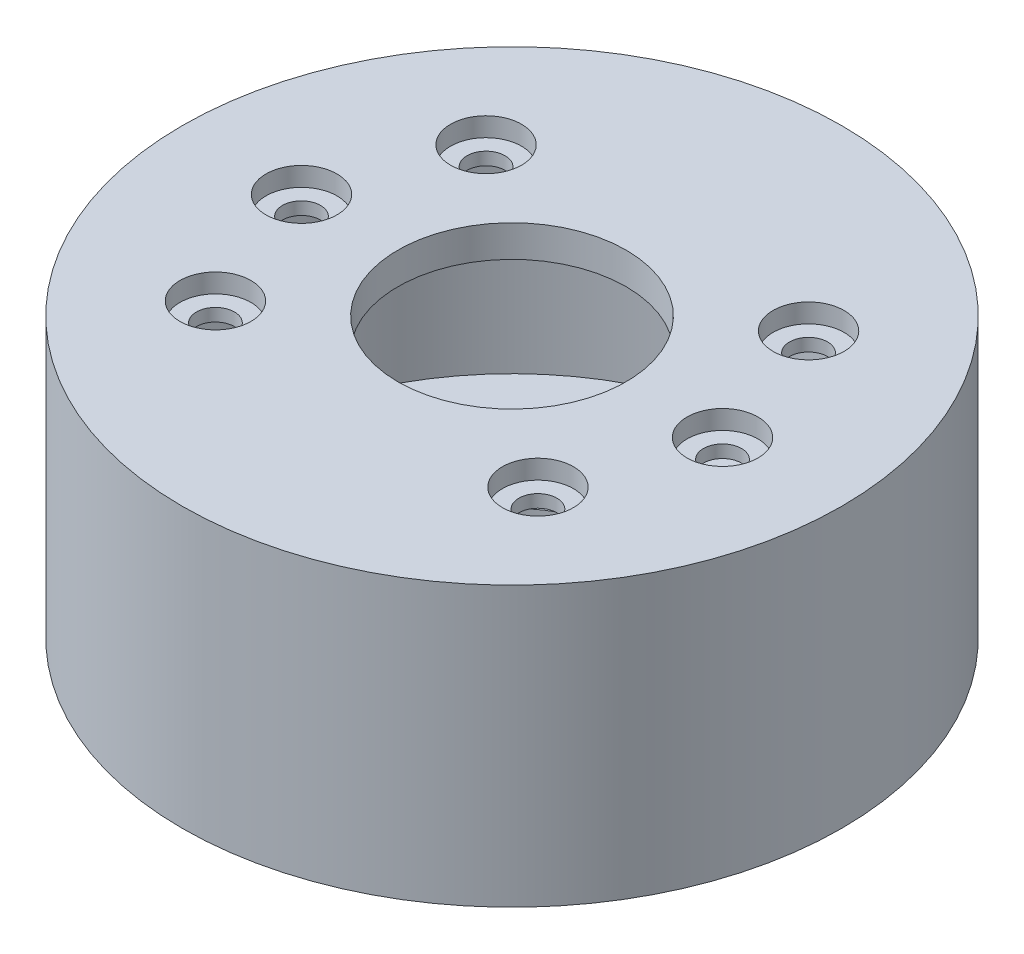
ISO-10303-21;
HEADER;
FILE_DESCRIPTION(('STEP AP214'),'2;1');
FILE_NAME('part.step','',(''),(''),'','','');
FILE_SCHEMA(('AUTOMOTIVE_DESIGN { 1 0 10303 214 1 1 1 1 }'));
ENDSEC;
DATA;
#1=APPLICATION_CONTEXT('core data for automotive mechanical design processes');
#2=APPLICATION_PROTOCOL_DEFINITION('international standard','automotive_design',2000,#1);
#3=PRODUCT_CONTEXT('',#1,'mechanical');
#4=PRODUCT('Part','Part','',(#3));
#5=PRODUCT_RELATED_PRODUCT_CATEGORY('part','',(#4));
#6=PRODUCT_DEFINITION_FORMATION('','',#4);
#7=PRODUCT_DEFINITION_CONTEXT('part definition',#1,'design');
#8=PRODUCT_DEFINITION('design','',#6,#7);
#9=PRODUCT_DEFINITION_SHAPE('','',#8);
#10=(LENGTH_UNIT() NAMED_UNIT(*) SI_UNIT(.MILLI.,.METRE.));
#11=(NAMED_UNIT(*) PLANE_ANGLE_UNIT() SI_UNIT($,.RADIAN.));
#12=(NAMED_UNIT(*) SI_UNIT($,.STERADIAN.) SOLID_ANGLE_UNIT());
#13=UNCERTAINTY_MEASURE_WITH_UNIT(LENGTH_MEASURE(1.E-05),#10,'distance_accuracy_value','');
#14=(GEOMETRIC_REPRESENTATION_CONTEXT(3) GLOBAL_UNCERTAINTY_ASSIGNED_CONTEXT((#13)) GLOBAL_UNIT_ASSIGNED_CONTEXT((#10,
#11,#12)) REPRESENTATION_CONTEXT('',''));
#15=CARTESIAN_POINT('',(0.,0.,0.));
#16=DIRECTION('',(0.,0.,1.));
#17=DIRECTION('',(1.,0.,0.));
#18=AXIS2_PLACEMENT_3D('',#15,#16,#17);
#19=CARTESIAN_POINT('',(-12.7163377557751,19.5,-10.6702743207965));
#20=DIRECTION('',(0.,1.,0.));
#21=DIRECTION('',(0.,0.,1.));
#22=AXIS2_PLACEMENT_3D('',#19,#20,#21);
#23=CYLINDRICAL_SURFACE('',#22,1.5);
#24=CARTESIAN_POINT('',(-12.7163377557751,19.5,-10.6702743207965));
#25=DIRECTION('',(0.,1.,0.));
#26=DIRECTION('',(0.,0.,1.));
#27=AXIS2_PLACEMENT_3D('',#24,#25,#26);
#28=CIRCLE('',#27,1.5);
#29=CARTESIAN_POINT('',(-12.7163377557751,19.5,-9.17027432079648));
#30=VERTEX_POINT('',#29);
#31=EDGE_CURVE('E189',#30,#30,#28,.T.);
#32=ORIENTED_EDGE('',*,*,#31,.F.);
#33=EDGE_LOOP('',(#32));
#34=FACE_BOUND('',#33,.T.);
#35=CARTESIAN_POINT('',(-12.7163377557751,20.5,-10.6702743207965));
#36=DIRECTION('',(0.,1.,0.));
#37=DIRECTION('',(0.,0.,1.));
#38=AXIS2_PLACEMENT_3D('',#35,#36,#37);
#39=CIRCLE('',#38,1.5);
#40=CARTESIAN_POINT('',(-12.7163377557751,20.5,-9.17027432079648));
#41=VERTEX_POINT('',#40);
#42=EDGE_CURVE('E79',#41,#41,#39,.F.);
#43=ORIENTED_EDGE('',*,*,#42,.F.);
#44=EDGE_LOOP('',(#43));
#45=FACE_BOUND('',#44,.T.);
#46=ADVANCED_FACE('F75',(#34,#45),#23,.F.);
#47=CARTESIAN_POINT('',(16.6,19.5,0.));
#48=DIRECTION('',(0.,1.,0.));
#49=DIRECTION('',(0.,0.,1.));
#50=AXIS2_PLACEMENT_3D('',#47,#48,#49);
#51=CYLINDRICAL_SURFACE('',#50,1.5);
#52=CARTESIAN_POINT('',(16.6,19.5,0.));
#53=DIRECTION('',(0.,1.,0.));
#54=DIRECTION('',(0.,0.,1.));
#55=AXIS2_PLACEMENT_3D('',#52,#53,#54);
#56=CIRCLE('',#55,1.5);
#57=CARTESIAN_POINT('',(16.6,19.5,1.5));
#58=VERTEX_POINT('',#57);
#59=EDGE_CURVE('E186',#58,#58,#56,.T.);
#60=ORIENTED_EDGE('',*,*,#59,.F.);
#61=EDGE_LOOP('',(#60));
#62=FACE_BOUND('',#61,.T.);
#63=CARTESIAN_POINT('',(16.6,20.5,0.));
#64=DIRECTION('',(0.,1.,0.));
#65=DIRECTION('',(0.,0.,1.));
#66=AXIS2_PLACEMENT_3D('',#63,#64,#65);
#67=CIRCLE('',#66,1.5);
#68=CARTESIAN_POINT('',(16.6,20.5,1.5));
#69=VERTEX_POINT('',#68);
#70=EDGE_CURVE('E129',#69,#69,#67,.F.);
#71=ORIENTED_EDGE('',*,*,#70,.F.);
#72=EDGE_LOOP('',(#71));
#73=FACE_BOUND('',#72,.T.);
#74=ADVANCED_FACE('F239',(#62,#73),#51,.F.);
#75=CARTESIAN_POINT('',(12.7163377557751,19.5,-10.6702743207965));
#76=DIRECTION('',(0.,1.,0.));
#77=DIRECTION('',(0.,0.,1.));
#78=AXIS2_PLACEMENT_3D('',#75,#76,#77);
#79=CYLINDRICAL_SURFACE('',#78,1.5);
#80=CARTESIAN_POINT('',(12.7163377557751,19.5,-10.6702743207965));
#81=DIRECTION('',(0.,1.,0.));
#82=DIRECTION('',(0.,0.,1.));
#83=AXIS2_PLACEMENT_3D('',#80,#81,#82);
#84=CIRCLE('',#83,1.5);
#85=CARTESIAN_POINT('',(12.7163377557751,19.5,-9.17027432079648));
#86=VERTEX_POINT('',#85);
#87=EDGE_CURVE('E183',#86,#86,#84,.T.);
#88=ORIENTED_EDGE('',*,*,#87,.F.);
#89=EDGE_LOOP('',(#88));
#90=FACE_BOUND('',#89,.T.);
#91=CARTESIAN_POINT('',(12.7163377557751,20.5,-10.6702743207965));
#92=DIRECTION('',(0.,1.,0.));
#93=DIRECTION('',(0.,0.,1.));
#94=AXIS2_PLACEMENT_3D('',#91,#92,#93);
#95=CIRCLE('',#94,1.5);
#96=CARTESIAN_POINT('',(12.7163377557751,20.5,-9.17027432079648));
#97=VERTEX_POINT('',#96);
#98=EDGE_CURVE('E127',#97,#97,#95,.F.);
#99=ORIENTED_EDGE('',*,*,#98,.F.);
#100=EDGE_LOOP('',(#99));
#101=FACE_BOUND('',#100,.T.);
#102=ADVANCED_FACE('F245',(#90,#101),#79,.F.);
#103=CARTESIAN_POINT('',(12.7163377557751,19.5,10.6702743207965));
#104=DIRECTION('',(0.,1.,0.));
#105=DIRECTION('',(0.,0.,1.));
#106=AXIS2_PLACEMENT_3D('',#103,#104,#105);
#107=CYLINDRICAL_SURFACE('',#106,1.5);
#108=CARTESIAN_POINT('',(12.7163377557751,19.5,10.6702743207965));
#109=DIRECTION('',(0.,1.,0.));
#110=DIRECTION('',(0.,0.,1.));
#111=AXIS2_PLACEMENT_3D('',#108,#109,#110);
#112=CIRCLE('',#111,1.5);
#113=CARTESIAN_POINT('',(12.7163377557751,19.5,12.1702743207965));
#114=VERTEX_POINT('',#113);
#115=EDGE_CURVE('E180',#114,#114,#112,.T.);
#116=ORIENTED_EDGE('',*,*,#115,.F.);
#117=EDGE_LOOP('',(#116));
#118=FACE_BOUND('',#117,.T.);
#119=CARTESIAN_POINT('',(12.7163377557751,20.5,10.6702743207965));
#120=DIRECTION('',(0.,1.,0.));
#121=DIRECTION('',(0.,0.,1.));
#122=AXIS2_PLACEMENT_3D('',#119,#120,#121);
#123=CIRCLE('',#122,1.5);
#124=CARTESIAN_POINT('',(12.7163377557751,20.5,12.1702743207965));
#125=VERTEX_POINT('',#124);
#126=EDGE_CURVE('E124',#125,#125,#123,.F.);
#127=ORIENTED_EDGE('',*,*,#126,.F.);
#128=EDGE_LOOP('',(#127));
#129=FACE_BOUND('',#128,.T.);
#130=ADVANCED_FACE('F366',(#118,#129),#107,.F.);
#131=CARTESIAN_POINT('',(-12.7163377557751,19.5,10.6702743207965));
#132=DIRECTION('',(0.,1.,0.));
#133=DIRECTION('',(0.,0.,1.));
#134=AXIS2_PLACEMENT_3D('',#131,#132,#133);
#135=CYLINDRICAL_SURFACE('',#134,1.5);
#136=CARTESIAN_POINT('',(-12.7163377557751,19.5,10.6702743207965));
#137=DIRECTION('',(0.,1.,0.));
#138=DIRECTION('',(0.,0.,1.));
#139=AXIS2_PLACEMENT_3D('',#136,#137,#138);
#140=CIRCLE('',#139,1.5);
#141=CARTESIAN_POINT('',(-12.7163377557751,19.5,12.1702743207965));
#142=VERTEX_POINT('',#141);
#143=EDGE_CURVE('E177',#142,#142,#140,.T.);
#144=ORIENTED_EDGE('',*,*,#143,.F.);
#145=EDGE_LOOP('',(#144));
#146=FACE_BOUND('',#145,.T.);
#147=CARTESIAN_POINT('',(-12.7163377557751,20.5,10.6702743207965));
#148=DIRECTION('',(0.,1.,0.));
#149=DIRECTION('',(0.,0.,1.));
#150=AXIS2_PLACEMENT_3D('',#147,#148,#149);
#151=CIRCLE('',#150,1.5);
#152=CARTESIAN_POINT('',(-12.7163377557751,20.5,12.1702743207965));
#153=VERTEX_POINT('',#152);
#154=EDGE_CURVE('E120',#153,#153,#151,.F.);
#155=ORIENTED_EDGE('',*,*,#154,.F.);
#156=EDGE_LOOP('',(#155));
#157=FACE_BOUND('',#156,.T.);
#158=ADVANCED_FACE('F307',(#146,#157),#135,.F.);
#159=CARTESIAN_POINT('',(-16.6,19.5,0.));
#160=DIRECTION('',(0.,1.,0.));
#161=DIRECTION('',(0.,0.,1.));
#162=AXIS2_PLACEMENT_3D('',#159,#160,#161);
#163=CYLINDRICAL_SURFACE('',#162,1.5);
#164=CARTESIAN_POINT('',(-16.6,19.5,0.));
#165=DIRECTION('',(0.,1.,0.));
#166=DIRECTION('',(0.,0.,1.));
#167=AXIS2_PLACEMENT_3D('',#164,#165,#166);
#168=CIRCLE('',#167,1.5);
#169=CARTESIAN_POINT('',(-16.6,19.5,1.5));
#170=VERTEX_POINT('',#169);
#171=EDGE_CURVE('E116',#170,#170,#168,.T.);
#172=ORIENTED_EDGE('',*,*,#171,.F.);
#173=EDGE_LOOP('',(#172));
#174=FACE_BOUND('',#173,.T.);
#175=CARTESIAN_POINT('',(-16.6,20.5,0.));
#176=DIRECTION('',(0.,1.,0.));
#177=DIRECTION('',(0.,0.,1.));
#178=AXIS2_PLACEMENT_3D('',#175,#176,#177);
#179=CIRCLE('',#178,1.5);
#180=CARTESIAN_POINT('',(-16.6,20.5,1.5));
#181=VERTEX_POINT('',#180);
#182=EDGE_CURVE('E117',#181,#181,#179,.F.);
#183=ORIENTED_EDGE('',*,*,#182,.F.);
#184=EDGE_LOOP('',(#183));
#185=FACE_BOUND('',#184,.T.);
#186=ADVANCED_FACE('F302',(#174,#185),#163,.F.);
#187=CARTESIAN_POINT('',(-12.7163377557751,2.5,-10.6702743207965));
#188=DIRECTION('',(0.,-1.,0.));
#189=DIRECTION('',(0.,0.,-1.));
#190=AXIS2_PLACEMENT_3D('',#187,#188,#189);
#191=CYLINDRICAL_SURFACE('',#190,1.5);
#192=CARTESIAN_POINT('',(-12.7163377557751,2.5,-10.6702743207965));
#193=DIRECTION('',(0.,1.,0.));
#194=DIRECTION('',(0.,0.,1.));
#195=AXIS2_PLACEMENT_3D('',#192,#193,#194);
#196=CIRCLE('',#195,1.5);
#197=CARTESIAN_POINT('',(-12.7163377557751,2.5,-9.17027432079648));
#198=VERTEX_POINT('',#197);
#199=EDGE_CURVE('E216',#198,#198,#196,.F.);
#200=ORIENTED_EDGE('',*,*,#199,.F.);
#201=EDGE_LOOP('',(#200));
#202=FACE_BOUND('',#201,.T.);
#203=CARTESIAN_POINT('',(-12.7163377557751,1.5,-10.6702743207965));
#204=DIRECTION('',(0.,-1.,0.));
#205=DIRECTION('',(0.,0.,-1.));
#206=AXIS2_PLACEMENT_3D('',#203,#204,#205);
#207=CIRCLE('',#206,1.5);
#208=CARTESIAN_POINT('',(-12.7163377557751,1.5,-12.1702743207965));
#209=VERTEX_POINT('',#208);
#210=EDGE_CURVE('E113',#209,#209,#207,.F.);
#211=ORIENTED_EDGE('',*,*,#210,.F.);
#212=EDGE_LOOP('',(#211));
#213=FACE_BOUND('',#212,.T.);
#214=ADVANCED_FACE('F299',(#202,#213),#191,.F.);
#215=CARTESIAN_POINT('',(16.6,2.5,0.));
#216=DIRECTION('',(0.,-1.,0.));
#217=DIRECTION('',(0.,0.,-1.));
#218=AXIS2_PLACEMENT_3D('',#215,#216,#217);
#219=CYLINDRICAL_SURFACE('',#218,1.5);
#220=CARTESIAN_POINT('',(16.6,2.5,0.));
#221=DIRECTION('',(0.,1.,0.));
#222=DIRECTION('',(0.,0.,1.));
#223=AXIS2_PLACEMENT_3D('',#220,#221,#222);
#224=CIRCLE('',#223,1.5);
#225=CARTESIAN_POINT('',(16.6,2.5,1.5));
#226=VERTEX_POINT('',#225);
#227=EDGE_CURVE('E213',#226,#226,#224,.T.);
#228=ORIENTED_EDGE('',*,*,#227,.T.);
#229=EDGE_LOOP('',(#228));
#230=FACE_BOUND('',#229,.T.);
#231=CARTESIAN_POINT('',(16.6,1.5,0.));
#232=DIRECTION('',(0.,-1.,0.));
#233=DIRECTION('',(0.,0.,-1.));
#234=AXIS2_PLACEMENT_3D('',#231,#232,#233);
#235=CIRCLE('',#234,1.5);
#236=CARTESIAN_POINT('',(16.6,1.5,-1.5));
#237=VERTEX_POINT('',#236);
#238=EDGE_CURVE('E110',#237,#237,#235,.T.);
#239=ORIENTED_EDGE('',*,*,#238,.T.);
#240=EDGE_LOOP('',(#239));
#241=FACE_BOUND('',#240,.T.);
#242=ADVANCED_FACE('F295',(#230,#241),#219,.F.);
#243=CARTESIAN_POINT('',(12.7163377557751,2.5,-10.6702743207965));
#244=DIRECTION('',(0.,-1.,0.));
#245=DIRECTION('',(0.,0.,-1.));
#246=AXIS2_PLACEMENT_3D('',#243,#244,#245);
#247=CYLINDRICAL_SURFACE('',#246,1.5);
#248=CARTESIAN_POINT('',(12.7163377557751,2.5,-10.6702743207965));
#249=DIRECTION('',(0.,1.,0.));
#250=DIRECTION('',(0.,0.,1.));
#251=AXIS2_PLACEMENT_3D('',#248,#249,#250);
#252=CIRCLE('',#251,1.5);
#253=CARTESIAN_POINT('',(12.7163377557751,2.5,-9.17027432079648));
#254=VERTEX_POINT('',#253);
#255=EDGE_CURVE('E210',#254,#254,#252,.T.);
#256=ORIENTED_EDGE('',*,*,#255,.T.);
#257=EDGE_LOOP('',(#256));
#258=FACE_BOUND('',#257,.T.);
#259=CARTESIAN_POINT('',(12.7163377557751,1.5,-10.6702743207965));
#260=DIRECTION('',(0.,-1.,0.));
#261=DIRECTION('',(0.,0.,-1.));
#262=AXIS2_PLACEMENT_3D('',#259,#260,#261);
#263=CIRCLE('',#262,1.5);
#264=CARTESIAN_POINT('',(12.7163377557751,1.5,-12.1702743207965));
#265=VERTEX_POINT('',#264);
#266=EDGE_CURVE('E107',#265,#265,#263,.T.);
#267=ORIENTED_EDGE('',*,*,#266,.T.);
#268=EDGE_LOOP('',(#267));
#269=FACE_BOUND('',#268,.T.);
#270=ADVANCED_FACE('F291',(#258,#269),#247,.F.);
#271=CARTESIAN_POINT('',(12.7163377557751,2.5,10.6702743207965));
#272=DIRECTION('',(0.,-1.,0.));
#273=DIRECTION('',(0.,0.,-1.));
#274=AXIS2_PLACEMENT_3D('',#271,#272,#273);
#275=CYLINDRICAL_SURFACE('',#274,1.5);
#276=CARTESIAN_POINT('',(12.7163377557751,2.5,10.6702743207965));
#277=DIRECTION('',(0.,1.,0.));
#278=DIRECTION('',(0.,0.,1.));
#279=AXIS2_PLACEMENT_3D('',#276,#277,#278);
#280=CIRCLE('',#279,1.5);
#281=CARTESIAN_POINT('',(12.7163377557751,2.5,12.1702743207965));
#282=VERTEX_POINT('',#281);
#283=EDGE_CURVE('E207',#282,#282,#280,.F.);
#284=ORIENTED_EDGE('',*,*,#283,.F.);
#285=EDGE_LOOP('',(#284));
#286=FACE_BOUND('',#285,.T.);
#287=CARTESIAN_POINT('',(12.7163377557751,1.5,10.6702743207965));
#288=DIRECTION('',(0.,-1.,0.));
#289=DIRECTION('',(0.,0.,-1.));
#290=AXIS2_PLACEMENT_3D('',#287,#288,#289);
#291=CIRCLE('',#290,1.5);
#292=CARTESIAN_POINT('',(12.7163377557751,1.5,9.17027432079648));
#293=VERTEX_POINT('',#292);
#294=EDGE_CURVE('E104',#293,#293,#291,.F.);
#295=ORIENTED_EDGE('',*,*,#294,.F.);
#296=EDGE_LOOP('',(#295));
#297=FACE_BOUND('',#296,.T.);
#298=ADVANCED_FACE('F287',(#286,#297),#275,.F.);
#299=CARTESIAN_POINT('',(-12.7163377557751,2.5,10.6702743207965));
#300=DIRECTION('',(0.,-1.,0.));
#301=DIRECTION('',(0.,0.,-1.));
#302=AXIS2_PLACEMENT_3D('',#299,#300,#301);
#303=CYLINDRICAL_SURFACE('',#302,1.5);
#304=CARTESIAN_POINT('',(-12.7163377557751,2.5,10.6702743207965));
#305=DIRECTION('',(0.,1.,0.));
#306=DIRECTION('',(0.,0.,1.));
#307=AXIS2_PLACEMENT_3D('',#304,#305,#306);
#308=CIRCLE('',#307,1.5);
#309=CARTESIAN_POINT('',(-12.7163377557751,2.5,12.1702743207965));
#310=VERTEX_POINT('',#309);
#311=EDGE_CURVE('E204',#310,#310,#308,.T.);
#312=ORIENTED_EDGE('',*,*,#311,.T.);
#313=EDGE_LOOP('',(#312));
#314=FACE_BOUND('',#313,.T.);
#315=CARTESIAN_POINT('',(-12.7163377557751,1.5,10.6702743207965));
#316=DIRECTION('',(0.,-1.,0.));
#317=DIRECTION('',(0.,0.,-1.));
#318=AXIS2_PLACEMENT_3D('',#315,#316,#317);
#319=CIRCLE('',#318,1.5);
#320=CARTESIAN_POINT('',(-12.7163377557751,1.5,9.17027432079649));
#321=VERTEX_POINT('',#320);
#322=EDGE_CURVE('E100',#321,#321,#319,.T.);
#323=ORIENTED_EDGE('',*,*,#322,.T.);
#324=EDGE_LOOP('',(#323));
#325=FACE_BOUND('',#324,.T.);
#326=ADVANCED_FACE('F283',(#314,#325),#303,.F.);
#327=CARTESIAN_POINT('',(-16.6,2.5,0.));
#328=DIRECTION('',(0.,-1.,0.));
#329=DIRECTION('',(0.,0.,-1.));
#330=AXIS2_PLACEMENT_3D('',#327,#328,#329);
#331=CYLINDRICAL_SURFACE('',#330,1.5);
#332=CARTESIAN_POINT('',(-16.6,2.5,0.));
#333=DIRECTION('',(0.,1.,0.));
#334=DIRECTION('',(0.,0.,1.));
#335=AXIS2_PLACEMENT_3D('',#332,#333,#334);
#336=CIRCLE('',#335,1.5);
#337=CARTESIAN_POINT('',(-16.6,2.5,1.5));
#338=VERTEX_POINT('',#337);
#339=EDGE_CURVE('E201',#338,#338,#336,.F.);
#340=ORIENTED_EDGE('',*,*,#339,.F.);
#341=EDGE_LOOP('',(#340));
#342=FACE_BOUND('',#341,.T.);
#343=CARTESIAN_POINT('',(-16.6,1.5,0.));
#344=DIRECTION('',(0.,-1.,0.));
#345=DIRECTION('',(0.,0.,-1.));
#346=AXIS2_PLACEMENT_3D('',#343,#344,#345);
#347=CIRCLE('',#346,1.5);
#348=CARTESIAN_POINT('',(-16.6,1.5,-1.49999999999999));
#349=VERTEX_POINT('',#348);
#350=EDGE_CURVE('E97',#349,#349,#347,.F.);
#351=ORIENTED_EDGE('',*,*,#350,.F.);
#352=EDGE_LOOP('',(#351));
#353=FACE_BOUND('',#352,.T.);
#354=ADVANCED_FACE('F280',(#342,#353),#331,.F.);
#355=CARTESIAN_POINT('',(0.,22.,0.));
#356=DIRECTION('',(0.,-1.,0.));
#357=DIRECTION('',(0.,0.,-1.));
#358=AXIS2_PLACEMENT_3D('',#355,#356,#357);
#359=CYLINDRICAL_SURFACE('',#358,22.);
#360=CARTESIAN_POINT('',(0.,2.5,0.));
#361=DIRECTION('',(0.,1.,0.));
#362=DIRECTION('',(0.,0.,1.));
#363=AXIS2_PLACEMENT_3D('',#360,#361,#362);
#364=CIRCLE('',#363,22.);
#365=CARTESIAN_POINT('',(0.,2.5,22.));
#366=VERTEX_POINT('',#365);
#367=EDGE_CURVE('E11',#366,#366,#364,.T.);
#368=ORIENTED_EDGE('',*,*,#367,.F.);
#369=EDGE_LOOP('',(#368));
#370=FACE_BOUND('',#369,.T.);
#371=CARTESIAN_POINT('',(0.,19.5,0.));
#372=DIRECTION('',(0.,1.,0.));
#373=DIRECTION('',(0.,0.,1.));
#374=AXIS2_PLACEMENT_3D('',#371,#372,#373);
#375=CIRCLE('',#374,22.);
#376=CARTESIAN_POINT('',(0.,19.5,22.));
#377=VERTEX_POINT('',#376);
#378=EDGE_CURVE('E196',#377,#377,#375,.T.);
#379=ORIENTED_EDGE('',*,*,#378,.T.);
#380=EDGE_LOOP('',(#379));
#381=FACE_BOUND('',#380,.T.);
#382=ADVANCED_FACE('F77',(#370,#381),#359,.F.);
#383=CARTESIAN_POINT('',(0.,22.,0.));
#384=DIRECTION('',(0.,-1.,0.));
#385=DIRECTION('',(0.,0.,-1.));
#386=AXIS2_PLACEMENT_3D('',#383,#384,#385);
#387=CYLINDRICAL_SURFACE('',#386,26.);
#388=CARTESIAN_POINT('',(0.,22.,0.));
#389=DIRECTION('',(0.,1.,0.));
#390=DIRECTION('',(0.,0.,1.));
#391=AXIS2_PLACEMENT_3D('',#388,#389,#390);
#392=CIRCLE('',#391,26.);
#393=CARTESIAN_POINT('',(0.,22.,26.));
#394=VERTEX_POINT('',#393);
#395=EDGE_CURVE('E83',#394,#394,#392,.T.);
#396=ORIENTED_EDGE('',*,*,#395,.F.);
#397=EDGE_LOOP('',(#396));
#398=FACE_BOUND('',#397,.T.);
#399=CARTESIAN_POINT('',(0.,0.,0.));
#400=DIRECTION('',(0.,1.,0.));
#401=DIRECTION('',(0.,0.,1.));
#402=AXIS2_PLACEMENT_3D('',#399,#400,#401);
#403=CIRCLE('',#402,26.);
#404=CARTESIAN_POINT('',(0.,0.,26.));
#405=VERTEX_POINT('',#404);
#406=EDGE_CURVE('E88',#405,#405,#403,.T.);
#407=ORIENTED_EDGE('',*,*,#406,.T.);
#408=EDGE_LOOP('',(#407));
#409=FACE_BOUND('',#408,.T.);
#410=ADVANCED_FACE('F267',(#398,#409),#387,.T.);
#411=CARTESIAN_POINT('',(0.,22.,0.));
#412=DIRECTION('',(0.,1.,0.));
#413=DIRECTION('',(0.,0.,1.));
#414=AXIS2_PLACEMENT_3D('',#411,#412,#413);
#415=PLANE('',#414);
#416=CARTESIAN_POINT('',(-16.6,22.,-1.16226472890446E-13));
#417=DIRECTION('',(0.,1.,0.));
#418=DIRECTION('',(0.,0.,1.));
#419=AXIS2_PLACEMENT_3D('',#416,#417,#418);
#420=CIRCLE('',#419,2.8);
#421=CARTESIAN_POINT('',(-16.6,22.,2.79999999999989));
#422=VERTEX_POINT('',#421);
#423=EDGE_CURVE('E445',#422,#422,#420,.T.);
#424=ORIENTED_EDGE('',*,*,#423,.F.);
#425=EDGE_LOOP('',(#424));
#426=FACE_BOUND('',#425,.T.);
#427=CARTESIAN_POINT('',(12.7163377557745,22.,-10.6702743207965));
#428=DIRECTION('',(0.,1.,0.));
#429=DIRECTION('',(0.,0.,1.));
#430=AXIS2_PLACEMENT_3D('',#427,#428,#429);
#431=CIRCLE('',#430,2.80000000000037);
#432=CARTESIAN_POINT('',(12.7163377557745,22.,-7.87027432079611));
#433=VERTEX_POINT('',#432);
#434=EDGE_CURVE('E452',#433,#433,#431,.T.);
#435=ORIENTED_EDGE('',*,*,#434,.F.);
#436=EDGE_LOOP('',(#435));
#437=FACE_BOUND('',#436,.T.);
#438=CARTESIAN_POINT('',(16.6,22.,-1.17961196366423E-13));
#439=DIRECTION('',(0.,1.,0.));
#440=DIRECTION('',(0.,0.,1.));
#441=AXIS2_PLACEMENT_3D('',#438,#439,#440);
#442=CIRCLE('',#441,2.8);
#443=CARTESIAN_POINT('',(16.6,22.,2.79999999999988));
#444=VERTEX_POINT('',#443);
#445=EDGE_CURVE('E433',#444,#444,#442,.T.);
#446=ORIENTED_EDGE('',*,*,#445,.F.);
#447=EDGE_LOOP('',(#446));
#448=FACE_BOUND('',#447,.T.);
#449=CARTESIAN_POINT('',(-12.7163377557751,22.,10.6702743207965));
#450=DIRECTION('',(0.,1.,0.));
#451=DIRECTION('',(0.,0.,1.));
#452=AXIS2_PLACEMENT_3D('',#449,#450,#451);
#453=CIRCLE('',#452,2.8);
#454=CARTESIAN_POINT('',(-12.7163377557751,22.,13.4702743207965));
#455=VERTEX_POINT('',#454);
#456=EDGE_CURVE('E440',#455,#455,#453,.T.);
#457=ORIENTED_EDGE('',*,*,#456,.F.);
#458=EDGE_LOOP('',(#457));
#459=FACE_BOUND('',#458,.T.);
#460=CARTESIAN_POINT('',(-12.7163377557749,22.,-10.6702743207967));
#461=DIRECTION('',(0.,1.,0.));
#462=DIRECTION('',(0.,0.,1.));
#463=AXIS2_PLACEMENT_3D('',#460,#461,#462);
#464=CIRCLE('',#463,2.8);
#465=CARTESIAN_POINT('',(-12.7163377557749,22.,-7.87027432079665));
#466=VERTEX_POINT('',#465);
#467=EDGE_CURVE('E456',#466,#466,#464,.T.);
#468=ORIENTED_EDGE('',*,*,#467,.F.);
#469=EDGE_LOOP('',(#468));
#470=FACE_BOUND('',#469,.T.);
#471=CARTESIAN_POINT('',(12.7163377557751,22.,10.6702743207965));
#472=DIRECTION('',(0.,1.,0.));
#473=DIRECTION('',(0.,0.,1.));
#474=AXIS2_PLACEMENT_3D('',#471,#472,#473);
#475=CIRCLE('',#474,2.8);
#476=CARTESIAN_POINT('',(12.7163377557751,22.,13.4702743207965));
#477=VERTEX_POINT('',#476);
#478=EDGE_CURVE('E428',#477,#477,#475,.T.);
#479=ORIENTED_EDGE('',*,*,#478,.F.);
#480=EDGE_LOOP('',(#479));
#481=FACE_BOUND('',#480,.T.);
#482=ORIENTED_EDGE('',*,*,#395,.T.);
#483=EDGE_LOOP('',(#482));
#484=FACE_BOUND('',#483,.T.);
#485=CARTESIAN_POINT('',(0.,22.,0.));
#486=DIRECTION('',(0.,1.,0.));
#487=DIRECTION('',(0.,0.,1.));
#488=AXIS2_PLACEMENT_3D('',#485,#486,#487);
#489=CIRCLE('',#488,9.);
#490=CARTESIAN_POINT('',(0.,22.,9.));
#491=VERTEX_POINT('',#490);
#492=EDGE_CURVE('E192',#491,#491,#489,.T.);
#493=ORIENTED_EDGE('',*,*,#492,.F.);
#494=EDGE_LOOP('',(#493));
#495=FACE_BOUND('',#494,.T.);
#496=ADVANCED_FACE('F265',(#426,#437,#448,#459,#470,#481,#484,#495),#415,.T.);
#497=CARTESIAN_POINT('',(0.,0.,0.));
#498=DIRECTION('',(0.,1.,0.));
#499=DIRECTION('',(0.,0.,1.));
#500=AXIS2_PLACEMENT_3D('',#497,#498,#499);
#501=PLANE('',#500);
#502=CARTESIAN_POINT('',(-16.6,0.,-1.16226472890446E-13));
#503=DIRECTION('',(0.,-1.,0.));
#504=DIRECTION('',(0.,0.,-1.));
#505=AXIS2_PLACEMENT_3D('',#502,#503,#504);
#506=CIRCLE('',#505,2.8);
#507=CARTESIAN_POINT('',(-16.6,0.,-2.80000000000012));
#508=VERTEX_POINT('',#507);
#509=EDGE_CURVE('E143',#508,#508,#506,.T.);
#510=ORIENTED_EDGE('',*,*,#509,.F.);
#511=EDGE_LOOP('',(#510));
#512=FACE_BOUND('',#511,.T.);
#513=CARTESIAN_POINT('',(12.7163377557745,0.,-10.6702743207965));
#514=DIRECTION('',(0.,-1.,0.));
#515=DIRECTION('',(0.,0.,-1.));
#516=AXIS2_PLACEMENT_3D('',#513,#514,#515);
#517=CIRCLE('',#516,2.80000000000037);
#518=CARTESIAN_POINT('',(12.7163377557745,0.,-13.4702743207969));
#519=VERTEX_POINT('',#518);
#520=EDGE_CURVE('E151',#519,#519,#517,.T.);
#521=ORIENTED_EDGE('',*,*,#520,.F.);
#522=EDGE_LOOP('',(#521));
#523=FACE_BOUND('',#522,.T.);
#524=CARTESIAN_POINT('',(16.6,0.,-1.17961196366423E-13));
#525=DIRECTION('',(0.,-1.,0.));
#526=DIRECTION('',(0.,0.,-1.));
#527=AXIS2_PLACEMENT_3D('',#524,#525,#526);
#528=CIRCLE('',#527,2.8);
#529=CARTESIAN_POINT('',(16.6,0.,-2.80000000000012));
#530=VERTEX_POINT('',#529);
#531=EDGE_CURVE('E150',#530,#530,#528,.T.);
#532=ORIENTED_EDGE('',*,*,#531,.F.);
#533=EDGE_LOOP('',(#532));
#534=FACE_BOUND('',#533,.T.);
#535=CARTESIAN_POINT('',(-12.7163377557751,0.,10.6702743207965));
#536=DIRECTION('',(0.,-1.,0.));
#537=DIRECTION('',(0.,0.,-1.));
#538=AXIS2_PLACEMENT_3D('',#535,#536,#537);
#539=CIRCLE('',#538,2.8);
#540=CARTESIAN_POINT('',(-12.7163377557751,0.,7.87027432079648));
#541=VERTEX_POINT('',#540);
#542=EDGE_CURVE('E163',#541,#541,#539,.T.);
#543=ORIENTED_EDGE('',*,*,#542,.F.);
#544=EDGE_LOOP('',(#543));
#545=FACE_BOUND('',#544,.T.);
#546=CARTESIAN_POINT('',(-12.7163377557749,0.,-10.6702743207967));
#547=DIRECTION('',(0.,-1.,0.));
#548=DIRECTION('',(0.,0.,-1.));
#549=AXIS2_PLACEMENT_3D('',#546,#547,#548);
#550=CIRCLE('',#549,2.8);
#551=CARTESIAN_POINT('',(-12.7163377557749,0.,-13.4702743207967));
#552=VERTEX_POINT('',#551);
#553=EDGE_CURVE('E134',#552,#552,#550,.T.);
#554=ORIENTED_EDGE('',*,*,#553,.F.);
#555=EDGE_LOOP('',(#554));
#556=FACE_BOUND('',#555,.T.);
#557=CARTESIAN_POINT('',(12.7163377557751,0.,10.6702743207965));
#558=DIRECTION('',(0.,-1.,0.));
#559=DIRECTION('',(0.,0.,-1.));
#560=AXIS2_PLACEMENT_3D('',#557,#558,#559);
#561=CIRCLE('',#560,2.8);
#562=CARTESIAN_POINT('',(12.7163377557751,0.,7.87027432079648));
#563=VERTEX_POINT('',#562);
#564=EDGE_CURVE('E162',#563,#563,#561,.T.);
#565=ORIENTED_EDGE('',*,*,#564,.F.);
#566=EDGE_LOOP('',(#565));
#567=FACE_BOUND('',#566,.T.);
#568=ORIENTED_EDGE('',*,*,#406,.F.);
#569=EDGE_LOOP('',(#568));
#570=FACE_BOUND('',#569,.T.);
#571=CARTESIAN_POINT('',(0.,0.,0.));
#572=DIRECTION('',(0.,1.,0.));
#573=DIRECTION('',(0.,0.,1.));
#574=AXIS2_PLACEMENT_3D('',#571,#572,#573);
#575=CIRCLE('',#574,9.);
#576=CARTESIAN_POINT('',(0.,0.,9.));
#577=VERTEX_POINT('',#576);
#578=EDGE_CURVE('E91',#577,#577,#575,.T.);
#579=ORIENTED_EDGE('',*,*,#578,.T.);
#580=EDGE_LOOP('',(#579));
#581=FACE_BOUND('',#580,.T.);
#582=ADVANCED_FACE('F235',(#512,#523,#534,#545,#556,#567,#570,#581),#501,.F.);
#583=CARTESIAN_POINT('',(0.,2.5,0.));
#584=DIRECTION('',(0.,-1.,0.));
#585=DIRECTION('',(0.,0.,-1.));
#586=AXIS2_PLACEMENT_3D('',#583,#584,#585);
#587=CYLINDRICAL_SURFACE('',#586,9.);
#588=CARTESIAN_POINT('',(0.,2.5,0.));
#589=DIRECTION('',(0.,1.,0.));
#590=DIRECTION('',(0.,0.,1.));
#591=AXIS2_PLACEMENT_3D('',#588,#589,#590);
#592=CIRCLE('',#591,9.);
#593=CARTESIAN_POINT('',(0.,2.5,9.));
#594=VERTEX_POINT('',#593);
#595=EDGE_CURVE('E96',#594,#594,#592,.T.);
#596=ORIENTED_EDGE('',*,*,#595,.T.);
#597=EDGE_LOOP('',(#596));
#598=FACE_BOUND('',#597,.T.);
#599=ORIENTED_EDGE('',*,*,#578,.F.);
#600=EDGE_LOOP('',(#599));
#601=FACE_BOUND('',#600,.T.);
#602=ADVANCED_FACE('F221',(#598,#601),#587,.F.);
#603=CARTESIAN_POINT('',(0.,2.5,0.));
#604=DIRECTION('',(0.,1.,0.));
#605=DIRECTION('',(0.,0.,1.));
#606=AXIS2_PLACEMENT_3D('',#603,#604,#605);
#607=PLANE('',#606);
#608=ORIENTED_EDGE('',*,*,#367,.T.);
#609=EDGE_LOOP('',(#608));
#610=FACE_BOUND('',#609,.T.);
#611=ORIENTED_EDGE('',*,*,#339,.T.);
#612=EDGE_LOOP('',(#611));
#613=FACE_BOUND('',#612,.T.);
#614=ORIENTED_EDGE('',*,*,#311,.F.);
#615=EDGE_LOOP('',(#614));
#616=FACE_BOUND('',#615,.T.);
#617=ORIENTED_EDGE('',*,*,#283,.T.);
#618=EDGE_LOOP('',(#617));
#619=FACE_BOUND('',#618,.T.);
#620=ORIENTED_EDGE('',*,*,#255,.F.);
#621=EDGE_LOOP('',(#620));
#622=FACE_BOUND('',#621,.T.);
#623=ORIENTED_EDGE('',*,*,#227,.F.);
#624=EDGE_LOOP('',(#623));
#625=FACE_BOUND('',#624,.T.);
#626=ORIENTED_EDGE('',*,*,#199,.T.);
#627=EDGE_LOOP('',(#626));
#628=FACE_BOUND('',#627,.T.);
#629=ORIENTED_EDGE('',*,*,#595,.F.);
#630=EDGE_LOOP('',(#629));
#631=FACE_BOUND('',#630,.T.);
#632=ADVANCED_FACE('F224',(#610,#613,#616,#619,#622,#625,#628,#631),#607,.T.);
#633=CARTESIAN_POINT('',(0.,19.5,0.));
#634=DIRECTION('',(0.,1.,0.));
#635=DIRECTION('',(0.,0.,1.));
#636=AXIS2_PLACEMENT_3D('',#633,#634,#635);
#637=PLANE('',#636);
#638=ORIENTED_EDGE('',*,*,#378,.F.);
#639=EDGE_LOOP('',(#638));
#640=FACE_BOUND('',#639,.T.);
#641=ORIENTED_EDGE('',*,*,#171,.T.);
#642=EDGE_LOOP('',(#641));
#643=FACE_BOUND('',#642,.T.);
#644=ORIENTED_EDGE('',*,*,#143,.T.);
#645=EDGE_LOOP('',(#644));
#646=FACE_BOUND('',#645,.T.);
#647=ORIENTED_EDGE('',*,*,#115,.T.);
#648=EDGE_LOOP('',(#647));
#649=FACE_BOUND('',#648,.T.);
#650=ORIENTED_EDGE('',*,*,#87,.T.);
#651=EDGE_LOOP('',(#650));
#652=FACE_BOUND('',#651,.T.);
#653=ORIENTED_EDGE('',*,*,#59,.T.);
#654=EDGE_LOOP('',(#653));
#655=FACE_BOUND('',#654,.T.);
#656=ORIENTED_EDGE('',*,*,#31,.T.);
#657=EDGE_LOOP('',(#656));
#658=FACE_BOUND('',#657,.T.);
#659=CARTESIAN_POINT('',(0.,19.5,0.));
#660=DIRECTION('',(0.,1.,0.));
#661=DIRECTION('',(0.,0.,1.));
#662=AXIS2_PLACEMENT_3D('',#659,#660,#661);
#663=CIRCLE('',#662,9.);
#664=CARTESIAN_POINT('',(0.,19.5,9.));
#665=VERTEX_POINT('',#664);
#666=EDGE_CURVE('E193',#665,#665,#663,.T.);
#667=ORIENTED_EDGE('',*,*,#666,.T.);
#668=EDGE_LOOP('',(#667));
#669=FACE_BOUND('',#668,.T.);
#670=ADVANCED_FACE('F226',(#640,#643,#646,#649,#652,#655,#658,#669),#637,.F.);
#671=CARTESIAN_POINT('',(0.,19.5,0.));
#672=DIRECTION('',(0.,1.,0.));
#673=DIRECTION('',(0.,0.,1.));
#674=AXIS2_PLACEMENT_3D('',#671,#672,#673);
#675=CYLINDRICAL_SURFACE('',#674,9.);
#676=ORIENTED_EDGE('',*,*,#666,.F.);
#677=EDGE_LOOP('',(#676));
#678=FACE_BOUND('',#677,.T.);
#679=ORIENTED_EDGE('',*,*,#492,.T.);
#680=EDGE_LOOP('',(#679));
#681=FACE_BOUND('',#680,.T.);
#682=ADVANCED_FACE('F232',(#678,#681),#675,.F.);
#683=CARTESIAN_POINT('',(-16.6,1.5,-1.16226472890446E-13));
#684=DIRECTION('',(0.,-1.,0.));
#685=DIRECTION('',(0.,0.,-1.));
#686=AXIS2_PLACEMENT_3D('',#683,#684,#685);
#687=PLANE('',#686);
#688=CARTESIAN_POINT('',(-16.6,1.5,-1.16226472890446E-13));
#689=DIRECTION('',(0.,-1.,0.));
#690=DIRECTION('',(0.,0.,-1.));
#691=AXIS2_PLACEMENT_3D('',#688,#689,#690);
#692=CIRCLE('',#691,2.8);
#693=CARTESIAN_POINT('',(-16.6,1.5,-2.80000000000012));
#694=VERTEX_POINT('',#693);
#695=EDGE_CURVE('E154',#694,#694,#692,.T.);
#696=ORIENTED_EDGE('',*,*,#695,.T.);
#697=EDGE_LOOP('',(#696));
#698=FACE_BOUND('',#697,.T.);
#699=ORIENTED_EDGE('',*,*,#350,.T.);
#700=EDGE_LOOP('',(#699));
#701=FACE_BOUND('',#700,.T.);
#702=ADVANCED_FACE('F253',(#698,#701),#687,.T.);
#703=CARTESIAN_POINT('',(-16.6,1.5,-1.16226472890446E-13));
#704=DIRECTION('',(0.,-1.,0.));
#705=DIRECTION('',(0.,0.,-1.));
#706=AXIS2_PLACEMENT_3D('',#703,#704,#705);
#707=CYLINDRICAL_SURFACE('',#706,2.8);
#708=ORIENTED_EDGE('',*,*,#695,.F.);
#709=EDGE_LOOP('',(#708));
#710=FACE_BOUND('',#709,.T.);
#711=ORIENTED_EDGE('',*,*,#509,.T.);
#712=EDGE_LOOP('',(#711));
#713=FACE_BOUND('',#712,.T.);
#714=ADVANCED_FACE('F258',(#710,#713),#707,.F.);
#715=CARTESIAN_POINT('',(-12.7163377557751,1.5,10.6702743207965));
#716=DIRECTION('',(0.,-1.,0.));
#717=DIRECTION('',(0.,0.,-1.));
#718=AXIS2_PLACEMENT_3D('',#715,#716,#717);
#719=CYLINDRICAL_SURFACE('',#718,2.8);
#720=CARTESIAN_POINT('',(-12.7163377557751,1.5,10.6702743207965));
#721=DIRECTION('',(0.,-1.,0.));
#722=DIRECTION('',(0.,0.,-1.));
#723=AXIS2_PLACEMENT_3D('',#720,#721,#722);
#724=CIRCLE('',#723,2.8);
#725=CARTESIAN_POINT('',(-12.7163377557751,1.5,7.87027432079648));
#726=VERTEX_POINT('',#725);
#727=EDGE_CURVE('E159',#726,#726,#724,.T.);
#728=ORIENTED_EDGE('',*,*,#727,.F.);
#729=EDGE_LOOP('',(#728));
#730=FACE_BOUND('',#729,.T.);
#731=ORIENTED_EDGE('',*,*,#542,.T.);
#732=EDGE_LOOP('',(#731));
#733=FACE_BOUND('',#732,.T.);
#734=ADVANCED_FACE('F345',(#730,#733),#719,.F.);
#735=CARTESIAN_POINT('',(-12.7163377557751,1.5,10.6702743207965));
#736=DIRECTION('',(0.,-1.,0.));
#737=DIRECTION('',(0.,0.,-1.));
#738=AXIS2_PLACEMENT_3D('',#735,#736,#737);
#739=PLANE('',#738);
#740=ORIENTED_EDGE('',*,*,#322,.F.);
#741=EDGE_LOOP('',(#740));
#742=FACE_BOUND('',#741,.T.);
#743=ORIENTED_EDGE('',*,*,#727,.T.);
#744=EDGE_LOOP('',(#743));
#745=FACE_BOUND('',#744,.T.);
#746=ADVANCED_FACE('F347',(#742,#745),#739,.T.);
#747=CARTESIAN_POINT('',(12.7163377557751,1.5,10.6702743207965));
#748=DIRECTION('',(0.,-1.,0.));
#749=DIRECTION('',(0.,0.,-1.));
#750=AXIS2_PLACEMENT_3D('',#747,#748,#749);
#751=PLANE('',#750);
#752=CARTESIAN_POINT('',(12.7163377557751,1.5,10.6702743207965));
#753=DIRECTION('',(0.,-1.,0.));
#754=DIRECTION('',(0.,0.,-1.));
#755=AXIS2_PLACEMENT_3D('',#752,#753,#754);
#756=CIRCLE('',#755,2.8);
#757=CARTESIAN_POINT('',(12.7163377557751,1.5,7.87027432079648));
#758=VERTEX_POINT('',#757);
#759=EDGE_CURVE('E101',#758,#758,#756,.T.);
#760=ORIENTED_EDGE('',*,*,#759,.T.);
#761=EDGE_LOOP('',(#760));
#762=FACE_BOUND('',#761,.T.);
#763=ORIENTED_EDGE('',*,*,#294,.T.);
#764=EDGE_LOOP('',(#763));
#765=FACE_BOUND('',#764,.T.);
#766=ADVANCED_FACE('F350',(#762,#765),#751,.T.);
#767=CARTESIAN_POINT('',(12.7163377557751,1.5,10.6702743207965));
#768=DIRECTION('',(0.,-1.,0.));
#769=DIRECTION('',(0.,0.,-1.));
#770=AXIS2_PLACEMENT_3D('',#767,#768,#769);
#771=CYLINDRICAL_SURFACE('',#770,2.8);
#772=ORIENTED_EDGE('',*,*,#759,.F.);
#773=EDGE_LOOP('',(#772));
#774=FACE_BOUND('',#773,.T.);
#775=ORIENTED_EDGE('',*,*,#564,.T.);
#776=EDGE_LOOP('',(#775));
#777=FACE_BOUND('',#776,.T.);
#778=ADVANCED_FACE('F340',(#774,#777),#771,.F.);
#779=CARTESIAN_POINT('',(12.7163377557745,1.5,-10.6702743207965));
#780=DIRECTION('',(0.,-1.,0.));
#781=DIRECTION('',(0.,0.,-1.));
#782=AXIS2_PLACEMENT_3D('',#779,#780,#781);
#783=CYLINDRICAL_SURFACE('',#782,2.80000000000037);
#784=CARTESIAN_POINT('',(12.7163377557745,1.5,-10.6702743207965));
#785=DIRECTION('',(0.,-1.,0.));
#786=DIRECTION('',(0.,0.,-1.));
#787=AXIS2_PLACEMENT_3D('',#784,#785,#786);
#788=CIRCLE('',#787,2.80000000000037);
#789=CARTESIAN_POINT('',(12.7163377557745,1.5,-13.4702743207969));
#790=VERTEX_POINT('',#789);
#791=EDGE_CURVE('E147',#790,#790,#788,.T.);
#792=ORIENTED_EDGE('',*,*,#791,.F.);
#793=EDGE_LOOP('',(#792));
#794=FACE_BOUND('',#793,.T.);
#795=ORIENTED_EDGE('',*,*,#520,.T.);
#796=EDGE_LOOP('',(#795));
#797=FACE_BOUND('',#796,.T.);
#798=ADVANCED_FACE('F337',(#794,#797),#783,.F.);
#799=CARTESIAN_POINT('',(12.7163377557745,1.5,-10.6702743207965));
#800=DIRECTION('',(0.,-1.,0.));
#801=DIRECTION('',(0.,0.,-1.));
#802=AXIS2_PLACEMENT_3D('',#799,#800,#801);
#803=PLANE('',#802);
#804=ORIENTED_EDGE('',*,*,#266,.F.);
#805=EDGE_LOOP('',(#804));
#806=FACE_BOUND('',#805,.T.);
#807=ORIENTED_EDGE('',*,*,#791,.T.);
#808=EDGE_LOOP('',(#807));
#809=FACE_BOUND('',#808,.T.);
#810=ADVANCED_FACE('F334',(#806,#809),#803,.T.);
#811=CARTESIAN_POINT('',(16.6,1.5,-1.17961196366423E-13));
#812=DIRECTION('',(0.,-1.,0.));
#813=DIRECTION('',(0.,0.,-1.));
#814=AXIS2_PLACEMENT_3D('',#811,#812,#813);
#815=CYLINDRICAL_SURFACE('',#814,2.8);
#816=CARTESIAN_POINT('',(16.6,1.5,-1.17961196366423E-13));
#817=DIRECTION('',(0.,-1.,0.));
#818=DIRECTION('',(0.,0.,-1.));
#819=AXIS2_PLACEMENT_3D('',#816,#817,#818);
#820=CIRCLE('',#819,2.8);
#821=CARTESIAN_POINT('',(16.6,1.5,-2.80000000000012));
#822=VERTEX_POINT('',#821);
#823=EDGE_CURVE('E166',#822,#822,#820,.T.);
#824=ORIENTED_EDGE('',*,*,#823,.F.);
#825=EDGE_LOOP('',(#824));
#826=FACE_BOUND('',#825,.T.);
#827=ORIENTED_EDGE('',*,*,#531,.T.);
#828=EDGE_LOOP('',(#827));
#829=FACE_BOUND('',#828,.T.);
#830=ADVANCED_FACE('F327',(#826,#829),#815,.F.);
#831=CARTESIAN_POINT('',(16.6,1.5,-1.17961196366423E-13));
#832=DIRECTION('',(0.,-1.,0.));
#833=DIRECTION('',(0.,0.,-1.));
#834=AXIS2_PLACEMENT_3D('',#831,#832,#833);
#835=PLANE('',#834);
#836=ORIENTED_EDGE('',*,*,#238,.F.);
#837=EDGE_LOOP('',(#836));
#838=FACE_BOUND('',#837,.T.);
#839=ORIENTED_EDGE('',*,*,#823,.T.);
#840=EDGE_LOOP('',(#839));
#841=FACE_BOUND('',#840,.T.);
#842=ADVANCED_FACE('F317',(#838,#841),#835,.T.);
#843=CARTESIAN_POINT('',(-12.7163377557749,1.5,-10.6702743207967));
#844=DIRECTION('',(0.,-1.,0.));
#845=DIRECTION('',(0.,0.,-1.));
#846=AXIS2_PLACEMENT_3D('',#843,#844,#845);
#847=PLANE('',#846);
#848=CARTESIAN_POINT('',(-12.7163377557749,1.5,-10.6702743207967));
#849=DIRECTION('',(0.,-1.,0.));
#850=DIRECTION('',(0.,0.,-1.));
#851=AXIS2_PLACEMENT_3D('',#848,#849,#850);
#852=CIRCLE('',#851,2.8);
#853=CARTESIAN_POINT('',(-12.7163377557749,1.5,-13.4702743207967));
#854=VERTEX_POINT('',#853);
#855=EDGE_CURVE('E138',#854,#854,#852,.T.);
#856=ORIENTED_EDGE('',*,*,#855,.T.);
#857=EDGE_LOOP('',(#856));
#858=FACE_BOUND('',#857,.T.);
#859=ORIENTED_EDGE('',*,*,#210,.T.);
#860=EDGE_LOOP('',(#859));
#861=FACE_BOUND('',#860,.T.);
#862=ADVANCED_FACE('F314',(#858,#861),#847,.T.);
#863=CARTESIAN_POINT('',(-12.7163377557749,1.5,-10.6702743207967));
#864=DIRECTION('',(0.,-1.,0.));
#865=DIRECTION('',(0.,0.,-1.));
#866=AXIS2_PLACEMENT_3D('',#863,#864,#865);
#867=CYLINDRICAL_SURFACE('',#866,2.8);
#868=ORIENTED_EDGE('',*,*,#855,.F.);
#869=EDGE_LOOP('',(#868));
#870=FACE_BOUND('',#869,.T.);
#871=ORIENTED_EDGE('',*,*,#553,.T.);
#872=EDGE_LOOP('',(#871));
#873=FACE_BOUND('',#872,.T.);
#874=ADVANCED_FACE('F316',(#870,#873),#867,.F.);
#875=CARTESIAN_POINT('',(-16.6,20.5,-1.16226472890446E-13));
#876=DIRECTION('',(0.,1.,0.));
#877=DIRECTION('',(0.,0.,1.));
#878=AXIS2_PLACEMENT_3D('',#875,#876,#877);
#879=PLANE('',#878);
#880=CARTESIAN_POINT('',(-16.6,20.5,-1.16226472890446E-13));
#881=DIRECTION('',(0.,1.,0.));
#882=DIRECTION('',(0.,0.,1.));
#883=AXIS2_PLACEMENT_3D('',#880,#881,#882);
#884=CIRCLE('',#883,2.8);
#885=CARTESIAN_POINT('',(-16.6,20.5,2.79999999999989));
#886=VERTEX_POINT('',#885);
#887=EDGE_CURVE('E448',#886,#886,#884,.T.);
#888=ORIENTED_EDGE('',*,*,#887,.T.);
#889=EDGE_LOOP('',(#888));
#890=FACE_BOUND('',#889,.T.);
#891=ORIENTED_EDGE('',*,*,#182,.T.);
#892=EDGE_LOOP('',(#891));
#893=FACE_BOUND('',#892,.T.);
#894=ADVANCED_FACE('F324',(#890,#893),#879,.T.);
#895=CARTESIAN_POINT('',(-16.6,20.5,-1.16226472890446E-13));
#896=DIRECTION('',(0.,1.,0.));
#897=DIRECTION('',(0.,0.,1.));
#898=AXIS2_PLACEMENT_3D('',#895,#896,#897);
#899=CYLINDRICAL_SURFACE('',#898,2.8);
#900=ORIENTED_EDGE('',*,*,#887,.F.);
#901=EDGE_LOOP('',(#900));
#902=FACE_BOUND('',#901,.T.);
#903=ORIENTED_EDGE('',*,*,#423,.T.);
#904=EDGE_LOOP('',(#903));
#905=FACE_BOUND('',#904,.T.);
#906=ADVANCED_FACE('F399',(#902,#905),#899,.F.);
#907=CARTESIAN_POINT('',(-12.7163377557751,20.5,10.6702743207965));
#908=DIRECTION('',(0.,1.,0.));
#909=DIRECTION('',(0.,0.,1.));
#910=AXIS2_PLACEMENT_3D('',#907,#908,#909);
#911=PLANE('',#910);
#912=CARTESIAN_POINT('',(-12.7163377557751,20.5,10.6702743207965));
#913=DIRECTION('',(0.,1.,0.));
#914=DIRECTION('',(0.,0.,1.));
#915=AXIS2_PLACEMENT_3D('',#912,#913,#914);
#916=CIRCLE('',#915,2.8);
#917=CARTESIAN_POINT('',(-12.7163377557751,20.5,13.4702743207965));
#918=VERTEX_POINT('',#917);
#919=EDGE_CURVE('E431',#918,#918,#916,.T.);
#920=ORIENTED_EDGE('',*,*,#919,.T.);
#921=EDGE_LOOP('',(#920));
#922=FACE_BOUND('',#921,.T.);
#923=ORIENTED_EDGE('',*,*,#154,.T.);
#924=EDGE_LOOP('',(#923));
#925=FACE_BOUND('',#924,.T.);
#926=ADVANCED_FACE('F403',(#922,#925),#911,.T.);
#927=CARTESIAN_POINT('',(-12.7163377557751,20.5,10.6702743207965));
#928=DIRECTION('',(0.,1.,0.));
#929=DIRECTION('',(0.,0.,1.));
#930=AXIS2_PLACEMENT_3D('',#927,#928,#929);
#931=CYLINDRICAL_SURFACE('',#930,2.8);
#932=ORIENTED_EDGE('',*,*,#919,.F.);
#933=EDGE_LOOP('',(#932));
#934=FACE_BOUND('',#933,.T.);
#935=ORIENTED_EDGE('',*,*,#456,.T.);
#936=EDGE_LOOP('',(#935));
#937=FACE_BOUND('',#936,.T.);
#938=ADVANCED_FACE('F407',(#934,#937),#931,.F.);
#939=CARTESIAN_POINT('',(12.7163377557751,20.5,10.6702743207965));
#940=DIRECTION('',(0.,1.,0.));
#941=DIRECTION('',(0.,0.,1.));
#942=AXIS2_PLACEMENT_3D('',#939,#940,#941);
#943=PLANE('',#942);
#944=CARTESIAN_POINT('',(12.7163377557751,20.5,10.6702743207965));
#945=DIRECTION('',(0.,1.,0.));
#946=DIRECTION('',(0.,0.,1.));
#947=AXIS2_PLACEMENT_3D('',#944,#945,#946);
#948=CIRCLE('',#947,2.8);
#949=CARTESIAN_POINT('',(12.7163377557751,20.5,13.4702743207965));
#950=VERTEX_POINT('',#949);
#951=EDGE_CURVE('E121',#950,#950,#948,.T.);
#952=ORIENTED_EDGE('',*,*,#951,.T.);
#953=EDGE_LOOP('',(#952));
#954=FACE_BOUND('',#953,.T.);
#955=ORIENTED_EDGE('',*,*,#126,.T.);
#956=EDGE_LOOP('',(#955));
#957=FACE_BOUND('',#956,.T.);
#958=ADVANCED_FACE('F390',(#954,#957),#943,.T.);
#959=CARTESIAN_POINT('',(12.7163377557751,20.5,10.6702743207965));
#960=DIRECTION('',(0.,1.,0.));
#961=DIRECTION('',(0.,0.,1.));
#962=AXIS2_PLACEMENT_3D('',#959,#960,#961);
#963=CYLINDRICAL_SURFACE('',#962,2.8);
#964=ORIENTED_EDGE('',*,*,#951,.F.);
#965=EDGE_LOOP('',(#964));
#966=FACE_BOUND('',#965,.T.);
#967=ORIENTED_EDGE('',*,*,#478,.T.);
#968=EDGE_LOOP('',(#967));
#969=FACE_BOUND('',#968,.T.);
#970=ADVANCED_FACE('F331',(#966,#969),#963,.F.);
#971=CARTESIAN_POINT('',(12.7163377557745,20.5,-10.6702743207965));
#972=DIRECTION('',(0.,1.,0.));
#973=DIRECTION('',(0.,0.,1.));
#974=AXIS2_PLACEMENT_3D('',#971,#972,#973);
#975=PLANE('',#974);
#976=CARTESIAN_POINT('',(12.7163377557745,20.5,-10.6702743207965));
#977=DIRECTION('',(0.,1.,0.));
#978=DIRECTION('',(0.,0.,1.));
#979=AXIS2_PLACEMENT_3D('',#976,#977,#978);
#980=CIRCLE('',#979,2.80000000000037);
#981=CARTESIAN_POINT('',(12.7163377557745,20.5,-7.87027432079611));
#982=VERTEX_POINT('',#981);
#983=EDGE_CURVE('E437',#982,#982,#980,.T.);
#984=ORIENTED_EDGE('',*,*,#983,.T.);
#985=EDGE_LOOP('',(#984));
#986=FACE_BOUND('',#985,.T.);
#987=ORIENTED_EDGE('',*,*,#98,.T.);
#988=EDGE_LOOP('',(#987));
#989=FACE_BOUND('',#988,.T.);
#990=ADVANCED_FACE('F378',(#986,#989),#975,.T.);
#991=CARTESIAN_POINT('',(12.7163377557745,20.5,-10.6702743207965));
#992=DIRECTION('',(0.,1.,0.));
#993=DIRECTION('',(0.,0.,1.));
#994=AXIS2_PLACEMENT_3D('',#991,#992,#993);
#995=CYLINDRICAL_SURFACE('',#994,2.80000000000037);
#996=ORIENTED_EDGE('',*,*,#983,.F.);
#997=EDGE_LOOP('',(#996));
#998=FACE_BOUND('',#997,.T.);
#999=ORIENTED_EDGE('',*,*,#434,.T.);
#1000=EDGE_LOOP('',(#999));
#1001=FACE_BOUND('',#1000,.T.);
#1002=ADVANCED_FACE('F380',(#998,#1001),#995,.F.);
#1003=CARTESIAN_POINT('',(16.6,20.5,-1.17961196366423E-13));
#1004=DIRECTION('',(0.,1.,0.));
#1005=DIRECTION('',(0.,0.,1.));
#1006=AXIS2_PLACEMENT_3D('',#1003,#1004,#1005);
#1007=PLANE('',#1006);
#1008=CARTESIAN_POINT('',(16.6,20.5,-1.17961196366423E-13));
#1009=DIRECTION('',(0.,1.,0.));
#1010=DIRECTION('',(0.,0.,1.));
#1011=AXIS2_PLACEMENT_3D('',#1008,#1009,#1010);
#1012=CIRCLE('',#1011,2.8);
#1013=CARTESIAN_POINT('',(16.6,20.5,2.79999999999988));
#1014=VERTEX_POINT('',#1013);
#1015=EDGE_CURVE('E436',#1014,#1014,#1012,.T.);
#1016=ORIENTED_EDGE('',*,*,#1015,.T.);
#1017=EDGE_LOOP('',(#1016));
#1018=FACE_BOUND('',#1017,.T.);
#1019=ORIENTED_EDGE('',*,*,#70,.T.);
#1020=EDGE_LOOP('',(#1019));
#1021=FACE_BOUND('',#1020,.T.);
#1022=ADVANCED_FACE('F387',(#1018,#1021),#1007,.T.);
#1023=CARTESIAN_POINT('',(16.6,20.5,-1.17961196366423E-13));
#1024=DIRECTION('',(0.,1.,0.));
#1025=DIRECTION('',(0.,0.,1.));
#1026=AXIS2_PLACEMENT_3D('',#1023,#1024,#1025);
#1027=CYLINDRICAL_SURFACE('',#1026,2.8);
#1028=ORIENTED_EDGE('',*,*,#1015,.F.);
#1029=EDGE_LOOP('',(#1028));
#1030=FACE_BOUND('',#1029,.T.);
#1031=ORIENTED_EDGE('',*,*,#445,.T.);
#1032=EDGE_LOOP('',(#1031));
#1033=FACE_BOUND('',#1032,.T.);
#1034=ADVANCED_FACE('F414',(#1030,#1033),#1027,.F.);
#1035=CARTESIAN_POINT('',(-12.7163377557749,20.5,-10.6702743207967));
#1036=DIRECTION('',(0.,1.,0.));
#1037=DIRECTION('',(0.,0.,1.));
#1038=AXIS2_PLACEMENT_3D('',#1035,#1036,#1037);
#1039=PLANE('',#1038);
#1040=CARTESIAN_POINT('',(-12.7163377557749,20.5,-10.6702743207967));
#1041=DIRECTION('',(0.,1.,0.));
#1042=DIRECTION('',(0.,0.,1.));
#1043=AXIS2_PLACEMENT_3D('',#1040,#1041,#1042);
#1044=CIRCLE('',#1043,2.8);
#1045=CARTESIAN_POINT('',(-12.7163377557749,20.5,-7.87027432079665));
#1046=VERTEX_POINT('',#1045);
#1047=EDGE_CURVE('E449',#1046,#1046,#1044,.T.);
#1048=ORIENTED_EDGE('',*,*,#1047,.T.);
#1049=EDGE_LOOP('',(#1048));
#1050=FACE_BOUND('',#1049,.T.);
#1051=ORIENTED_EDGE('',*,*,#42,.T.);
#1052=EDGE_LOOP('',(#1051));
#1053=FACE_BOUND('',#1052,.T.);
#1054=ADVANCED_FACE('F417',(#1050,#1053),#1039,.T.);
#1055=CARTESIAN_POINT('',(-12.7163377557749,20.5,-10.6702743207967));
#1056=DIRECTION('',(0.,1.,0.));
#1057=DIRECTION('',(0.,0.,1.));
#1058=AXIS2_PLACEMENT_3D('',#1055,#1056,#1057);
#1059=CYLINDRICAL_SURFACE('',#1058,2.8);
#1060=ORIENTED_EDGE('',*,*,#1047,.F.);
#1061=EDGE_LOOP('',(#1060));
#1062=FACE_BOUND('',#1061,.T.);
#1063=ORIENTED_EDGE('',*,*,#467,.T.);
#1064=EDGE_LOOP('',(#1063));
#1065=FACE_BOUND('',#1064,.T.);
#1066=ADVANCED_FACE('F394',(#1062,#1065),#1059,.F.);
#1067=CLOSED_SHELL('',(#46,#74,#102,#130,#158,#186,#214,#242,#270,#298,#326,#354,#382,#410,#496,
#582,#602,#632,#670,#682,#702,#714,#734,#746,#766,#778,#798,#810,#830,#842,#862,#874,#894,#906,
#926,#938,#958,#970,#990,#1002,#1022,#1034,#1054,#1066));
#1068=MANIFOLD_SOLID_BREP('B2',#1067);
#1069=ADVANCED_BREP_SHAPE_REPRESENTATION('',(#18,#1068),#14);
#1070=SHAPE_DEFINITION_REPRESENTATION(#9,#1069);
ENDSEC;
END-ISO-10303-21;
